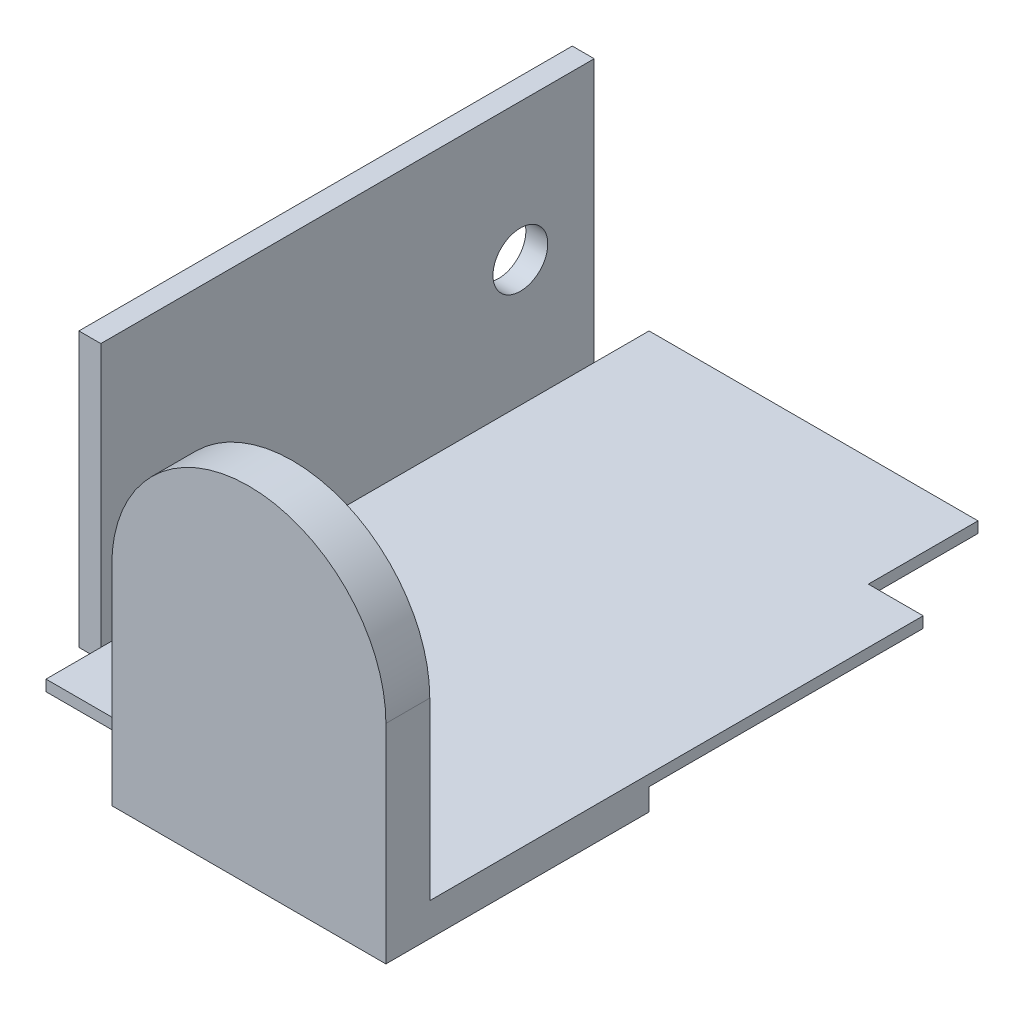
ISO-10303-21;
HEADER;
FILE_DESCRIPTION(('STEP AP214'),'2;1');
FILE_NAME('part.step','',(''),(''),'','','');
FILE_SCHEMA(('AUTOMOTIVE_DESIGN { 1 0 10303 214 1 1 1 1 }'));
ENDSEC;
DATA;
#1=APPLICATION_CONTEXT('core data for automotive mechanical design processes');
#2=APPLICATION_PROTOCOL_DEFINITION('international standard','automotive_design',2000,#1);
#3=PRODUCT_CONTEXT('',#1,'mechanical');
#4=PRODUCT('Part','Part','',(#3));
#5=PRODUCT_RELATED_PRODUCT_CATEGORY('part','',(#4));
#6=PRODUCT_DEFINITION_FORMATION('','',#4);
#7=PRODUCT_DEFINITION_CONTEXT('part definition',#1,'design');
#8=PRODUCT_DEFINITION('design','',#6,#7);
#9=PRODUCT_DEFINITION_SHAPE('','',#8);
#10=(LENGTH_UNIT() NAMED_UNIT(*) SI_UNIT(.MILLI.,.METRE.));
#11=(NAMED_UNIT(*) PLANE_ANGLE_UNIT() SI_UNIT($,.RADIAN.));
#12=(NAMED_UNIT(*) SI_UNIT($,.STERADIAN.) SOLID_ANGLE_UNIT());
#13=UNCERTAINTY_MEASURE_WITH_UNIT(LENGTH_MEASURE(1.E-05),#10,'distance_accuracy_value','');
#14=(GEOMETRIC_REPRESENTATION_CONTEXT(3) GLOBAL_UNCERTAINTY_ASSIGNED_CONTEXT((#13)) GLOBAL_UNIT_ASSIGNED_CONTEXT((#10,
#11,#12)) REPRESENTATION_CONTEXT('',''));
#15=CARTESIAN_POINT('',(0.,0.,0.));
#16=DIRECTION('',(0.,0.,1.));
#17=DIRECTION('',(1.,0.,0.));
#18=AXIS2_PLACEMENT_3D('',#15,#16,#17);
#19=CARTESIAN_POINT('',(0.,1.,0.));
#20=DIRECTION('',(0.,-1.,0.));
#21=DIRECTION('',(0.,0.,-1.));
#22=AXIS2_PLACEMENT_3D('',#19,#20,#21);
#23=PLANE('',#22);
#24=DIRECTION('',(-1.,0.,0.));
#25=VECTOR('',#24,1.);
#26=CARTESIAN_POINT('',(35.,1.,0.));
#27=LINE('',#26,#25);
#28=CARTESIAN_POINT('',(35.,1.,0.));
#29=VERTEX_POINT('',#28);
#30=CARTESIAN_POINT('',(10.,0.999999999999997,0.));
#31=VERTEX_POINT('',#30);
#32=EDGE_CURVE('E309',#29,#31,#27,.T.);
#33=ORIENTED_EDGE('',*,*,#32,.F.);
#34=DIRECTION('',(0.,0.,-1.));
#35=VECTOR('',#34,1.);
#36=CARTESIAN_POINT('',(35.,1.,0.));
#37=LINE('',#36,#35);
#38=CARTESIAN_POINT('',(35.,1.,-45.));
#39=VERTEX_POINT('',#38);
#40=EDGE_CURVE('E254',#29,#39,#37,.T.);
#41=ORIENTED_EDGE('',*,*,#40,.T.);
#42=DIRECTION('',(-1.,0.,0.));
#43=VECTOR('',#42,1.);
#44=CARTESIAN_POINT('',(0.,1.,-45.));
#45=LINE('',#44,#43);
#46=CARTESIAN_POINT('',(30.,1.,-45.));
#47=VERTEX_POINT('',#46);
#48=EDGE_CURVE('E204',#39,#47,#45,.T.);
#49=ORIENTED_EDGE('',*,*,#48,.T.);
#50=DIRECTION('',(0.,0.,1.));
#51=VECTOR('',#50,1.);
#52=CARTESIAN_POINT('',(30.,1.,0.));
#53=LINE('',#52,#51);
#54=CARTESIAN_POINT('',(30.,1.,-55.));
#55=VERTEX_POINT('',#54);
#56=EDGE_CURVE('E211',#55,#47,#53,.T.);
#57=ORIENTED_EDGE('',*,*,#56,.F.);
#58=DIRECTION('',(1.,0.,0.));
#59=VECTOR('',#58,1.);
#60=CARTESIAN_POINT('',(0.,1.,-55.));
#61=LINE('',#60,#59);
#62=CARTESIAN_POINT('',(0.,1.,-55.));
#63=VERTEX_POINT('',#62);
#64=EDGE_CURVE('E249',#63,#55,#61,.T.);
#65=ORIENTED_EDGE('',*,*,#64,.F.);
#66=DIRECTION('',(0.,0.,-1.));
#67=VECTOR('',#66,1.);
#68=CARTESIAN_POINT('',(0.,1.,0.));
#69=LINE('',#68,#67);
#70=CARTESIAN_POINT('',(0.,1.,-50.));
#71=VERTEX_POINT('',#70);
#72=EDGE_CURVE('E251',#71,#63,#69,.T.);
#73=ORIENTED_EDGE('',*,*,#72,.F.);
#74=CARTESIAN_POINT('',(0.,1.,-5.));
#75=VERTEX_POINT('',#74);
#76=EDGE_CURVE('E250',#75,#71,#69,.T.);
#77=ORIENTED_EDGE('',*,*,#76,.F.);
#78=CARTESIAN_POINT('',(0.,1.,0.));
#79=VERTEX_POINT('',#78);
#80=EDGE_CURVE('E246',#79,#75,#69,.T.);
#81=ORIENTED_EDGE('',*,*,#80,.F.);
#82=DIRECTION('',(1.,0.,0.));
#83=VECTOR('',#82,1.);
#84=CARTESIAN_POINT('',(0.,1.,0.));
#85=LINE('',#84,#83);
#86=EDGE_CURVE('E256',#79,#31,#85,.T.);
#87=ORIENTED_EDGE('',*,*,#86,.T.);
#88=EDGE_LOOP('',(#33,#41,#49,#57,#65,#73,#77,#81,#87));
#89=FACE_BOUND('',#88,.T.);
#90=ADVANCED_FACE('F43',(#89),#23,.F.);
#91=CARTESIAN_POINT('',(0.,1.,0.));
#92=DIRECTION('',(0.,0.,-1.));
#93=DIRECTION('',(-1.,0.,0.));
#94=AXIS2_PLACEMENT_3D('',#91,#92,#93);
#95=PLANE('',#94);
#96=DIRECTION('',(0.,-1.,0.));
#97=VECTOR('',#96,1.);
#98=CARTESIAN_POINT('',(10.,0.999999999999997,0.));
#99=LINE('',#98,#97);
#100=CARTESIAN_POINT('',(10.,0.,0.));
#101=VERTEX_POINT('',#100);
#102=EDGE_CURVE('E65',#31,#101,#99,.T.);
#103=ORIENTED_EDGE('',*,*,#102,.F.);
#104=ORIENTED_EDGE('',*,*,#86,.F.);
#105=DIRECTION('',(0.,-1.,0.));
#106=VECTOR('',#105,1.);
#107=CARTESIAN_POINT('',(0.,1.,0.));
#108=LINE('',#107,#106);
#109=CARTESIAN_POINT('',(0.,0.,0.));
#110=VERTEX_POINT('',#109);
#111=EDGE_CURVE('E51',#79,#110,#108,.T.);
#112=ORIENTED_EDGE('',*,*,#111,.T.);
#113=DIRECTION('',(1.,0.,0.));
#114=VECTOR('',#113,1.);
#115=CARTESIAN_POINT('',(0.,0.,0.));
#116=LINE('',#115,#114);
#117=EDGE_CURVE('E268',#110,#101,#116,.T.);
#118=ORIENTED_EDGE('',*,*,#117,.T.);
#119=EDGE_LOOP('',(#103,#104,#112,#118));
#120=FACE_BOUND('',#119,.T.);
#121=ADVANCED_FACE('F307',(#120),#95,.F.);
#122=CARTESIAN_POINT('',(0.,0.,0.));
#123=DIRECTION('',(0.,-1.,0.));
#124=DIRECTION('',(0.,0.,-1.));
#125=AXIS2_PLACEMENT_3D('',#122,#123,#124);
#126=PLANE('',#125);
#127=DIRECTION('',(0.,0.,-1.));
#128=VECTOR('',#127,1.);
#129=CARTESIAN_POINT('',(35.,0.,0.));
#130=LINE('',#129,#128);
#131=CARTESIAN_POINT('',(35.,0.,-20.));
#132=VERTEX_POINT('',#131);
#133=CARTESIAN_POINT('',(35.,0.,-45.));
#134=VERTEX_POINT('',#133);
#135=EDGE_CURVE('E266',#132,#134,#130,.T.);
#136=ORIENTED_EDGE('',*,*,#135,.F.);
#137=DIRECTION('',(-1.,0.,0.));
#138=VECTOR('',#137,1.);
#139=CARTESIAN_POINT('',(35.,0.,-20.));
#140=LINE('',#139,#138);
#141=CARTESIAN_POINT('',(10.,0.,-20.));
#142=VERTEX_POINT('',#141);
#143=EDGE_CURVE('E180',#132,#142,#140,.T.);
#144=ORIENTED_EDGE('',*,*,#143,.T.);
#145=DIRECTION('',(0.,0.,-1.));
#146=VECTOR('',#145,1.);
#147=CARTESIAN_POINT('',(10.,0.,0.));
#148=LINE('',#147,#146);
#149=EDGE_CURVE('E187',#101,#142,#148,.T.);
#150=ORIENTED_EDGE('',*,*,#149,.F.);
#151=ORIENTED_EDGE('',*,*,#117,.F.);
#152=DIRECTION('',(0.,0.,-1.));
#153=VECTOR('',#152,1.);
#154=CARTESIAN_POINT('',(0.,0.,0.));
#155=LINE('',#154,#153);
#156=CARTESIAN_POINT('',(0.,0.,-5.));
#157=VERTEX_POINT('',#156);
#158=EDGE_CURVE('E260',#110,#157,#155,.T.);
#159=ORIENTED_EDGE('',*,*,#158,.T.);
#160=DIRECTION('',(1.,0.,0.));
#161=VECTOR('',#160,1.);
#162=CARTESIAN_POINT('',(-2.,0.,-5.));
#163=LINE('',#162,#161);
#164=CARTESIAN_POINT('',(-2.,0.,-5.));
#165=VERTEX_POINT('',#164);
#166=EDGE_CURVE('E226',#165,#157,#163,.T.);
#167=ORIENTED_EDGE('',*,*,#166,.F.);
#168=DIRECTION('',(0.,0.,-1.));
#169=VECTOR('',#168,1.);
#170=CARTESIAN_POINT('',(-2.,0.,-5.));
#171=LINE('',#170,#169);
#172=CARTESIAN_POINT('',(-2.00000000000001,0.,-50.));
#173=VERTEX_POINT('',#172);
#174=EDGE_CURVE('E223',#165,#173,#171,.T.);
#175=ORIENTED_EDGE('',*,*,#174,.T.);
#176=DIRECTION('',(1.,0.,0.));
#177=VECTOR('',#176,1.);
#178=CARTESIAN_POINT('',(-2.00000000000001,0.,-50.));
#179=LINE('',#178,#177);
#180=CARTESIAN_POINT('',(0.,0.,-50.));
#181=VERTEX_POINT('',#180);
#182=EDGE_CURVE('E237',#173,#181,#179,.T.);
#183=ORIENTED_EDGE('',*,*,#182,.T.);
#184=CARTESIAN_POINT('',(0.,0.,-55.));
#185=VERTEX_POINT('',#184);
#186=EDGE_CURVE('E245',#181,#185,#155,.T.);
#187=ORIENTED_EDGE('',*,*,#186,.T.);
#188=DIRECTION('',(1.,0.,0.));
#189=VECTOR('',#188,1.);
#190=CARTESIAN_POINT('',(0.,0.,-55.));
#191=LINE('',#190,#189);
#192=CARTESIAN_POINT('',(30.,0.,-55.));
#193=VERTEX_POINT('',#192);
#194=EDGE_CURVE('E263',#185,#193,#191,.T.);
#195=ORIENTED_EDGE('',*,*,#194,.T.);
#196=DIRECTION('',(0.,0.,1.));
#197=VECTOR('',#196,1.);
#198=CARTESIAN_POINT('',(30.,0.,-55.));
#199=LINE('',#198,#197);
#200=CARTESIAN_POINT('',(30.,0.,-45.));
#201=VERTEX_POINT('',#200);
#202=EDGE_CURVE('E197',#193,#201,#199,.T.);
#203=ORIENTED_EDGE('',*,*,#202,.T.);
#204=DIRECTION('',(-1.,0.,0.));
#205=VECTOR('',#204,1.);
#206=CARTESIAN_POINT('',(35.,0.,-45.));
#207=LINE('',#206,#205);
#208=EDGE_CURVE('E192',#134,#201,#207,.T.);
#209=ORIENTED_EDGE('',*,*,#208,.F.);
#210=EDGE_LOOP('',(#136,#144,#150,#151,#159,#167,#175,#183,#187,#195,#203,#209));
#211=FACE_BOUND('',#210,.T.);
#212=ADVANCED_FACE('F282',(#211),#126,.T.);
#213=CARTESIAN_POINT('',(0.,1.,-55.));
#214=DIRECTION('',(0.,0.,-1.));
#215=DIRECTION('',(-1.,0.,0.));
#216=AXIS2_PLACEMENT_3D('',#213,#214,#215);
#217=PLANE('',#216);
#218=ORIENTED_EDGE('',*,*,#64,.T.);
#219=DIRECTION('',(0.,-1.,0.));
#220=VECTOR('',#219,1.);
#221=CARTESIAN_POINT('',(30.,2.,-55.));
#222=LINE('',#221,#220);
#223=EDGE_CURVE('E201',#55,#193,#222,.T.);
#224=ORIENTED_EDGE('',*,*,#223,.T.);
#225=ORIENTED_EDGE('',*,*,#194,.F.);
#226=DIRECTION('',(0.,-1.,0.));
#227=VECTOR('',#226,1.);
#228=CARTESIAN_POINT('',(0.,1.,-55.));
#229=LINE('',#228,#227);
#230=EDGE_CURVE('E259',#63,#185,#229,.T.);
#231=ORIENTED_EDGE('',*,*,#230,.F.);
#232=EDGE_LOOP('',(#218,#224,#225,#231));
#233=FACE_BOUND('',#232,.T.);
#234=ADVANCED_FACE('F280',(#233),#217,.T.);
#235=CARTESIAN_POINT('',(0.,1.,0.));
#236=DIRECTION('',(-1.,0.,0.));
#237=DIRECTION('',(0.,0.,1.));
#238=AXIS2_PLACEMENT_3D('',#235,#236,#237);
#239=PLANE('',#238);
#240=ORIENTED_EDGE('',*,*,#186,.F.);
#241=DIRECTION('',(0.,1.,0.));
#242=VECTOR('',#241,1.);
#243=CARTESIAN_POINT('',(0.,0.,-50.));
#244=LINE('',#243,#242);
#245=EDGE_CURVE('E218',#181,#71,#244,.T.);
#246=ORIENTED_EDGE('',*,*,#245,.T.);
#247=ORIENTED_EDGE('',*,*,#72,.T.);
#248=ORIENTED_EDGE('',*,*,#230,.T.);
#249=EDGE_LOOP('',(#240,#246,#247,#248));
#250=FACE_BOUND('',#249,.T.);
#251=ADVANCED_FACE('F276',(#250),#239,.T.);
#252=DIRECTION('',(0.,1.,0.));
#253=VECTOR('',#252,1.);
#254=CARTESIAN_POINT('',(0.,0.,-5.));
#255=LINE('',#254,#253);
#256=EDGE_CURVE('E227',#157,#75,#255,.T.);
#257=ORIENTED_EDGE('',*,*,#256,.F.);
#258=ORIENTED_EDGE('',*,*,#158,.F.);
#259=ORIENTED_EDGE('',*,*,#111,.F.);
#260=ORIENTED_EDGE('',*,*,#80,.T.);
#261=EDGE_LOOP('',(#257,#258,#259,#260));
#262=FACE_BOUND('',#261,.T.);
#263=ADVANCED_FACE('F45',(#262),#239,.T.);
#264=CARTESIAN_POINT('',(35.,1.,0.));
#265=DIRECTION('',(-1.,0.,0.));
#266=DIRECTION('',(0.,0.,1.));
#267=AXIS2_PLACEMENT_3D('',#264,#265,#266);
#268=PLANE('',#267);
#269=DIRECTION('',(0.,1.,0.));
#270=VECTOR('',#269,1.);
#271=CARTESIAN_POINT('',(35.,1.,4.));
#272=LINE('',#271,#270);
#273=CARTESIAN_POINT('',(35.,-2.,4.));
#274=VERTEX_POINT('',#273);
#275=CARTESIAN_POINT('',(35.,17.,4.));
#276=VERTEX_POINT('',#275);
#277=EDGE_CURVE('E178',#274,#276,#272,.T.);
#278=ORIENTED_EDGE('',*,*,#277,.F.);
#279=DIRECTION('',(0.,0.,-1.));
#280=VECTOR('',#279,1.);
#281=CARTESIAN_POINT('',(35.,-2.,0.));
#282=LINE('',#281,#280);
#283=CARTESIAN_POINT('',(35.,-2.,-20.));
#284=VERTEX_POINT('',#283);
#285=EDGE_CURVE('E58',#274,#284,#282,.T.);
#286=ORIENTED_EDGE('',*,*,#285,.T.);
#287=DIRECTION('',(0.,1.,0.));
#288=VECTOR('',#287,1.);
#289=CARTESIAN_POINT('',(35.,-2.,-20.));
#290=LINE('',#289,#288);
#291=EDGE_CURVE('E168',#284,#132,#290,.T.);
#292=ORIENTED_EDGE('',*,*,#291,.T.);
#293=ORIENTED_EDGE('',*,*,#135,.T.);
#294=DIRECTION('',(0.,-1.,0.));
#295=VECTOR('',#294,1.);
#296=CARTESIAN_POINT('',(35.,2.,-45.));
#297=LINE('',#296,#295);
#298=EDGE_CURVE('E200',#39,#134,#297,.T.);
#299=ORIENTED_EDGE('',*,*,#298,.F.);
#300=ORIENTED_EDGE('',*,*,#40,.F.);
#301=DIRECTION('',(0.,-1.,0.));
#302=VECTOR('',#301,1.);
#303=CARTESIAN_POINT('',(35.,1.,0.));
#304=LINE('',#303,#302);
#305=CARTESIAN_POINT('',(35.,17.,0.));
#306=VERTEX_POINT('',#305);
#307=EDGE_CURVE('E322',#306,#29,#304,.T.);
#308=ORIENTED_EDGE('',*,*,#307,.F.);
#309=DIRECTION('',(0.,0.,-1.));
#310=VECTOR('',#309,1.);
#311=CARTESIAN_POINT('',(35.,17.,2.));
#312=LINE('',#311,#310);
#313=EDGE_CURVE('E182',#276,#306,#312,.T.);
#314=ORIENTED_EDGE('',*,*,#313,.F.);
#315=EDGE_LOOP('',(#278,#286,#292,#293,#299,#300,#308,#314));
#316=FACE_BOUND('',#315,.T.);
#317=ADVANCED_FACE('F320',(#316),#268,.F.);
#318=CARTESIAN_POINT('',(0.,0.,0.));
#319=DIRECTION('',(-1.,0.,0.));
#320=DIRECTION('',(0.,0.,1.));
#321=AXIS2_PLACEMENT_3D('',#318,#319,#320);
#322=PLANE('',#321);
#323=CARTESIAN_POINT('',(0.,12.5,-43.2636621767649));
#324=DIRECTION('',(-1.,0.,0.));
#325=DIRECTION('',(0.,0.,1.));
#326=AXIS2_PLACEMENT_3D('',#323,#324,#325);
#327=CIRCLE('',#326,2.5);
#328=CARTESIAN_POINT('',(0.,12.5,-40.7636621767649));
#329=VERTEX_POINT('',#328);
#330=EDGE_CURVE('E517',#329,#329,#327,.T.);
#331=ORIENTED_EDGE('',*,*,#330,.T.);
#332=EDGE_LOOP('',(#331));
#333=FACE_BOUND('',#332,.T.);
#334=CARTESIAN_POINT('',(0.,25.,-5.));
#335=VERTEX_POINT('',#334);
#336=EDGE_CURVE('E213',#75,#335,#255,.T.);
#337=ORIENTED_EDGE('',*,*,#336,.F.);
#338=ORIENTED_EDGE('',*,*,#76,.T.);
#339=CARTESIAN_POINT('',(0.,25.,-50.));
#340=VERTEX_POINT('',#339);
#341=EDGE_CURVE('E233',#71,#340,#244,.T.);
#342=ORIENTED_EDGE('',*,*,#341,.T.);
#343=DIRECTION('',(0.,0.,-1.));
#344=VECTOR('',#343,1.);
#345=CARTESIAN_POINT('',(0.,25.,-5.));
#346=LINE('',#345,#344);
#347=EDGE_CURVE('E230',#335,#340,#346,.T.);
#348=ORIENTED_EDGE('',*,*,#347,.F.);
#349=EDGE_LOOP('',(#337,#338,#342,#348));
#350=FACE_BOUND('',#349,.T.);
#351=ADVANCED_FACE('F296',(#333,#350),#322,.F.);
#352=CARTESIAN_POINT('',(-2.,0.,-5.));
#353=DIRECTION('',(0.,0.,-1.));
#354=DIRECTION('',(-1.,0.,0.));
#355=AXIS2_PLACEMENT_3D('',#352,#353,#354);
#356=PLANE('',#355);
#357=ORIENTED_EDGE('',*,*,#256,.T.);
#358=ORIENTED_EDGE('',*,*,#336,.T.);
#359=DIRECTION('',(1.,0.,0.));
#360=VECTOR('',#359,1.);
#361=CARTESIAN_POINT('',(-2.,25.,-5.));
#362=LINE('',#361,#360);
#363=CARTESIAN_POINT('',(-2.,25.,-5.));
#364=VERTEX_POINT('',#363);
#365=EDGE_CURVE('E242',#364,#335,#362,.T.);
#366=ORIENTED_EDGE('',*,*,#365,.F.);
#367=DIRECTION('',(0.,1.,0.));
#368=VECTOR('',#367,1.);
#369=CARTESIAN_POINT('',(-2.,0.,-5.));
#370=LINE('',#369,#368);
#371=EDGE_CURVE('E214',#165,#364,#370,.T.);
#372=ORIENTED_EDGE('',*,*,#371,.F.);
#373=ORIENTED_EDGE('',*,*,#166,.T.);
#374=EDGE_LOOP('',(#357,#358,#366,#372,#373));
#375=FACE_BOUND('',#374,.T.);
#376=ADVANCED_FACE('F301',(#375),#356,.F.);
#377=CARTESIAN_POINT('',(-2.,25.,-5.));
#378=DIRECTION('',(0.,-1.,0.));
#379=DIRECTION('',(0.,0.,-1.));
#380=AXIS2_PLACEMENT_3D('',#377,#378,#379);
#381=PLANE('',#380);
#382=ORIENTED_EDGE('',*,*,#347,.T.);
#383=DIRECTION('',(1.,0.,0.));
#384=VECTOR('',#383,1.);
#385=CARTESIAN_POINT('',(-2.00000000000001,25.,-50.));
#386=LINE('',#385,#384);
#387=CARTESIAN_POINT('',(-2.00000000000001,25.,-50.));
#388=VERTEX_POINT('',#387);
#389=EDGE_CURVE('E239',#388,#340,#386,.T.);
#390=ORIENTED_EDGE('',*,*,#389,.F.);
#391=DIRECTION('',(0.,0.,-1.));
#392=VECTOR('',#391,1.);
#393=CARTESIAN_POINT('',(-2.,25.,-5.));
#394=LINE('',#393,#392);
#395=EDGE_CURVE('E217',#364,#388,#394,.T.);
#396=ORIENTED_EDGE('',*,*,#395,.F.);
#397=ORIENTED_EDGE('',*,*,#365,.T.);
#398=EDGE_LOOP('',(#382,#390,#396,#397));
#399=FACE_BOUND('',#398,.T.);
#400=ADVANCED_FACE('F371',(#399),#381,.F.);
#401=CARTESIAN_POINT('',(-2.00000000000001,0.,-50.));
#402=DIRECTION('',(0.,0.,-1.));
#403=DIRECTION('',(-1.,0.,0.));
#404=AXIS2_PLACEMENT_3D('',#401,#402,#403);
#405=PLANE('',#404);
#406=ORIENTED_EDGE('',*,*,#245,.F.);
#407=ORIENTED_EDGE('',*,*,#182,.F.);
#408=DIRECTION('',(0.,1.,0.));
#409=VECTOR('',#408,1.);
#410=CARTESIAN_POINT('',(-2.00000000000001,0.,-50.));
#411=LINE('',#410,#409);
#412=EDGE_CURVE('E220',#173,#388,#411,.T.);
#413=ORIENTED_EDGE('',*,*,#412,.T.);
#414=ORIENTED_EDGE('',*,*,#389,.T.);
#415=ORIENTED_EDGE('',*,*,#341,.F.);
#416=EDGE_LOOP('',(#406,#407,#413,#414,#415));
#417=FACE_BOUND('',#416,.T.);
#418=ADVANCED_FACE('F288',(#417),#405,.T.);
#419=CARTESIAN_POINT('',(-2.,0.,0.));
#420=DIRECTION('',(-1.,0.,0.));
#421=DIRECTION('',(0.,0.,1.));
#422=AXIS2_PLACEMENT_3D('',#419,#420,#421);
#423=PLANE('',#422);
#424=CARTESIAN_POINT('',(-2.00000000000001,12.5,-43.2636621767649));
#425=DIRECTION('',(-1.,0.,0.));
#426=DIRECTION('',(0.,0.,1.));
#427=AXIS2_PLACEMENT_3D('',#424,#425,#426);
#428=CIRCLE('',#427,2.5);
#429=CARTESIAN_POINT('',(-2.00000000000001,12.5,-40.7636621767649));
#430=VERTEX_POINT('',#429);
#431=EDGE_CURVE('E520',#430,#430,#428,.T.);
#432=ORIENTED_EDGE('',*,*,#431,.F.);
#433=EDGE_LOOP('',(#432));
#434=FACE_BOUND('',#433,.T.);
#435=ORIENTED_EDGE('',*,*,#371,.T.);
#436=ORIENTED_EDGE('',*,*,#395,.T.);
#437=ORIENTED_EDGE('',*,*,#412,.F.);
#438=ORIENTED_EDGE('',*,*,#174,.F.);
#439=EDGE_LOOP('',(#435,#436,#437,#438));
#440=FACE_BOUND('',#439,.T.);
#441=ADVANCED_FACE('F384',(#434,#440),#423,.T.);
#442=CARTESIAN_POINT('',(30.,2.,-55.));
#443=DIRECTION('',(1.,0.,0.));
#444=DIRECTION('',(0.,0.,-1.));
#445=AXIS2_PLACEMENT_3D('',#442,#443,#444);
#446=PLANE('',#445);
#447=ORIENTED_EDGE('',*,*,#56,.T.);
#448=DIRECTION('',(0.,-1.,0.));
#449=VECTOR('',#448,1.);
#450=CARTESIAN_POINT('',(30.,2.,-45.));
#451=LINE('',#450,#449);
#452=EDGE_CURVE('E205',#47,#201,#451,.T.);
#453=ORIENTED_EDGE('',*,*,#452,.T.);
#454=ORIENTED_EDGE('',*,*,#202,.F.);
#455=ORIENTED_EDGE('',*,*,#223,.F.);
#456=EDGE_LOOP('',(#447,#453,#454,#455));
#457=FACE_BOUND('',#456,.T.);
#458=ADVANCED_FACE('F396',(#457),#446,.T.);
#459=CARTESIAN_POINT('',(35.,2.,-45.));
#460=DIRECTION('',(0.,0.,1.));
#461=DIRECTION('',(1.,0.,0.));
#462=AXIS2_PLACEMENT_3D('',#459,#460,#461);
#463=PLANE('',#462);
#464=ORIENTED_EDGE('',*,*,#298,.T.);
#465=ORIENTED_EDGE('',*,*,#208,.T.);
#466=ORIENTED_EDGE('',*,*,#452,.F.);
#467=ORIENTED_EDGE('',*,*,#48,.F.);
#468=EDGE_LOOP('',(#464,#465,#466,#467));
#469=FACE_BOUND('',#468,.T.);
#470=ADVANCED_FACE('F325',(#469),#463,.F.);
#471=CARTESIAN_POINT('',(10.,-2.,0.));
#472=DIRECTION('',(1.,0.,0.));
#473=DIRECTION('',(0.,0.,-1.));
#474=AXIS2_PLACEMENT_3D('',#471,#472,#473);
#475=PLANE('',#474);
#476=DIRECTION('',(0.,0.,-1.));
#477=VECTOR('',#476,1.);
#478=CARTESIAN_POINT('',(10.,-2.,0.));
#479=LINE('',#478,#477);
#480=CARTESIAN_POINT('',(10.,-2.,4.));
#481=VERTEX_POINT('',#480);
#482=CARTESIAN_POINT('',(10.,-2.,-20.));
#483=VERTEX_POINT('',#482);
#484=EDGE_CURVE('E160',#481,#483,#479,.T.);
#485=ORIENTED_EDGE('',*,*,#484,.F.);
#486=DIRECTION('',(0.,-1.,0.));
#487=VECTOR('',#486,1.);
#488=CARTESIAN_POINT('',(10.,0.999999999999997,4.));
#489=LINE('',#488,#487);
#490=CARTESIAN_POINT('',(10.,17.,4.));
#491=VERTEX_POINT('',#490);
#492=EDGE_CURVE('E163',#491,#481,#489,.T.);
#493=ORIENTED_EDGE('',*,*,#492,.F.);
#494=DIRECTION('',(0.,0.,-1.));
#495=VECTOR('',#494,1.);
#496=CARTESIAN_POINT('',(10.,17.,2.));
#497=LINE('',#496,#495);
#498=CARTESIAN_POINT('',(10.,17.,0.));
#499=VERTEX_POINT('',#498);
#500=EDGE_CURVE('E314',#491,#499,#497,.T.);
#501=ORIENTED_EDGE('',*,*,#500,.T.);
#502=DIRECTION('',(0.,1.,0.));
#503=VECTOR('',#502,1.);
#504=CARTESIAN_POINT('',(10.,1.,0.));
#505=LINE('',#504,#503);
#506=EDGE_CURVE('E315',#31,#499,#505,.T.);
#507=ORIENTED_EDGE('',*,*,#506,.F.);
#508=ORIENTED_EDGE('',*,*,#102,.T.);
#509=ORIENTED_EDGE('',*,*,#149,.T.);
#510=DIRECTION('',(0.,1.,0.));
#511=VECTOR('',#510,1.);
#512=CARTESIAN_POINT('',(10.,-2.,-20.));
#513=LINE('',#512,#511);
#514=EDGE_CURVE('E166',#483,#142,#513,.T.);
#515=ORIENTED_EDGE('',*,*,#514,.F.);
#516=EDGE_LOOP('',(#485,#493,#501,#507,#508,#509,#515));
#517=FACE_BOUND('',#516,.T.);
#518=ADVANCED_FACE('F161',(#517),#475,.F.);
#519=CARTESIAN_POINT('',(35.,-2.,-20.));
#520=DIRECTION('',(0.,0.,-1.));
#521=DIRECTION('',(-1.,0.,0.));
#522=AXIS2_PLACEMENT_3D('',#519,#520,#521);
#523=PLANE('',#522);
#524=ORIENTED_EDGE('',*,*,#143,.F.);
#525=ORIENTED_EDGE('',*,*,#291,.F.);
#526=DIRECTION('',(-1.,0.,0.));
#527=VECTOR('',#526,1.);
#528=CARTESIAN_POINT('',(35.,-2.,-20.));
#529=LINE('',#528,#527);
#530=EDGE_CURVE('E169',#284,#483,#529,.T.);
#531=ORIENTED_EDGE('',*,*,#530,.T.);
#532=ORIENTED_EDGE('',*,*,#514,.T.);
#533=EDGE_LOOP('',(#524,#525,#531,#532));
#534=FACE_BOUND('',#533,.T.);
#535=ADVANCED_FACE('F329',(#534),#523,.T.);
#536=CARTESIAN_POINT('',(0.,-2.,0.));
#537=DIRECTION('',(0.,1.,0.));
#538=DIRECTION('',(0.,0.,1.));
#539=AXIS2_PLACEMENT_3D('',#536,#537,#538);
#540=PLANE('',#539);
#541=ORIENTED_EDGE('',*,*,#285,.F.);
#542=DIRECTION('',(1.,0.,0.));
#543=VECTOR('',#542,1.);
#544=CARTESIAN_POINT('',(22.5,-2.,4.));
#545=LINE('',#544,#543);
#546=EDGE_CURVE('E11',#481,#274,#545,.T.);
#547=ORIENTED_EDGE('',*,*,#546,.F.);
#548=ORIENTED_EDGE('',*,*,#484,.T.);
#549=ORIENTED_EDGE('',*,*,#530,.F.);
#550=EDGE_LOOP('',(#541,#547,#548,#549));
#551=FACE_BOUND('',#550,.T.);
#552=ADVANCED_FACE('F171',(#551),#540,.F.);
#553=CARTESIAN_POINT('',(22.5,-15.,4.));
#554=DIRECTION('',(0.,0.,-1.));
#555=DIRECTION('',(1.,0.,0.));
#556=AXIS2_PLACEMENT_3D('',#553,#554,#555);
#557=PLANE('',#556);
#558=ORIENTED_EDGE('',*,*,#492,.T.);
#559=ORIENTED_EDGE('',*,*,#546,.T.);
#560=ORIENTED_EDGE('',*,*,#277,.T.);
#561=CARTESIAN_POINT('',(22.5,17.,4.));
#562=DIRECTION('',(0.,0.,-1.));
#563=DIRECTION('',(1.,0.,0.));
#564=AXIS2_PLACEMENT_3D('',#561,#562,#563);
#565=CIRCLE('',#564,12.5);
#566=EDGE_CURVE('E177',#491,#276,#565,.T.);
#567=ORIENTED_EDGE('',*,*,#566,.F.);
#568=EDGE_LOOP('',(#558,#559,#560,#567));
#569=FACE_BOUND('',#568,.T.);
#570=ADVANCED_FACE('F175',(#569),#557,.F.);
#571=CARTESIAN_POINT('',(22.5,17.,2.));
#572=DIRECTION('',(0.,0.,-1.));
#573=DIRECTION('',(-1.,0.,0.));
#574=AXIS2_PLACEMENT_3D('',#571,#572,#573);
#575=CYLINDRICAL_SURFACE('',#574,12.5);
#576=CARTESIAN_POINT('',(22.5,17.,0.));
#577=DIRECTION('',(0.,0.,-1.));
#578=DIRECTION('',(1.,0.,0.));
#579=AXIS2_PLACEMENT_3D('',#576,#577,#578);
#580=CIRCLE('',#579,12.5);
#581=EDGE_CURVE('E526',#499,#306,#580,.T.);
#582=ORIENTED_EDGE('',*,*,#581,.F.);
#583=ORIENTED_EDGE('',*,*,#500,.F.);
#584=ORIENTED_EDGE('',*,*,#566,.T.);
#585=ORIENTED_EDGE('',*,*,#313,.T.);
#586=EDGE_LOOP('',(#582,#583,#584,#585));
#587=FACE_BOUND('',#586,.T.);
#588=ADVANCED_FACE('F486',(#587),#575,.T.);
#589=CARTESIAN_POINT('',(22.5,17.,0.));
#590=DIRECTION('',(0.,0.,1.));
#591=DIRECTION('',(1.,0.,0.));
#592=AXIS2_PLACEMENT_3D('',#589,#590,#591);
#593=PLANE('',#592);
#594=ORIENTED_EDGE('',*,*,#307,.T.);
#595=ORIENTED_EDGE('',*,*,#32,.T.);
#596=ORIENTED_EDGE('',*,*,#506,.T.);
#597=ORIENTED_EDGE('',*,*,#581,.T.);
#598=EDGE_LOOP('',(#594,#595,#596,#597));
#599=FACE_BOUND('',#598,.T.);
#600=ADVANCED_FACE('F495',(#599),#593,.F.);
#601=CARTESIAN_POINT('',(0.,12.5,-43.2636621767649));
#602=DIRECTION('',(-1.,0.,0.));
#603=DIRECTION('',(0.,0.,1.));
#604=AXIS2_PLACEMENT_3D('',#601,#602,#603);
#605=CYLINDRICAL_SURFACE('',#604,2.5);
#606=ORIENTED_EDGE('',*,*,#330,.F.);
#607=EDGE_LOOP('',(#606));
#608=FACE_BOUND('',#607,.T.);
#609=ORIENTED_EDGE('',*,*,#431,.T.);
#610=EDGE_LOOP('',(#609));
#611=FACE_BOUND('',#610,.T.);
#612=ADVANCED_FACE('F504',(#608,#611),#605,.F.);
#613=CLOSED_SHELL('',(#90,#121,#212,#234,#251,#263,#317,#351,#376,#400,#418,#441,#458,#470,#518,
#535,#552,#570,#588,#600,#612));
#614=MANIFOLD_SOLID_BREP('B2',#613);
#615=ADVANCED_BREP_SHAPE_REPRESENTATION('',(#18,#614),#14);
#616=SHAPE_DEFINITION_REPRESENTATION(#9,#615);
ENDSEC;
END-ISO-10303-21;
